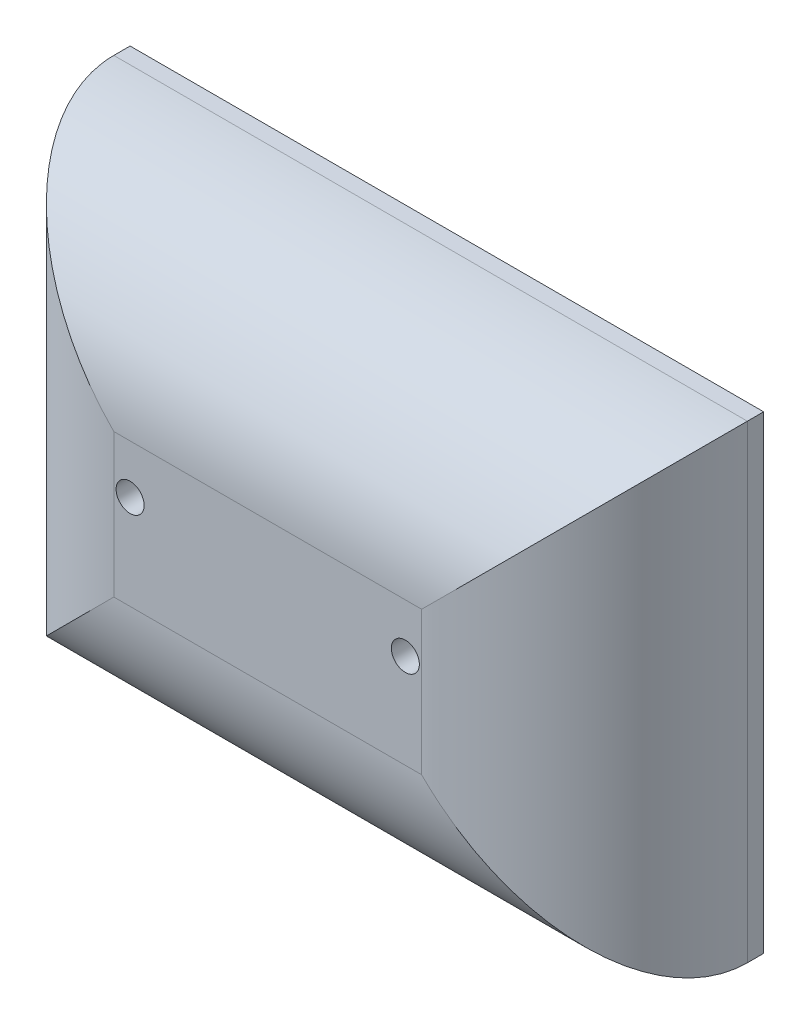
ISO-10303-21;
HEADER;
FILE_DESCRIPTION(('STEP AP214'),'2;1');
FILE_NAME('part.step','',(''),(''),'','','');
FILE_SCHEMA(('AUTOMOTIVE_DESIGN { 1 0 10303 214 1 1 1 1 }'));
ENDSEC;
DATA;
#1=APPLICATION_CONTEXT('core data for automotive mechanical design processes');
#2=APPLICATION_PROTOCOL_DEFINITION('international standard','automotive_design',2000,#1);
#3=PRODUCT_CONTEXT('',#1,'mechanical');
#4=PRODUCT('Part','Part','',(#3));
#5=PRODUCT_RELATED_PRODUCT_CATEGORY('part','',(#4));
#6=PRODUCT_DEFINITION_FORMATION('','',#4);
#7=PRODUCT_DEFINITION_CONTEXT('part definition',#1,'design');
#8=PRODUCT_DEFINITION('design','',#6,#7);
#9=PRODUCT_DEFINITION_SHAPE('','',#8);
#10=(LENGTH_UNIT() NAMED_UNIT(*) SI_UNIT(.MILLI.,.METRE.));
#11=(NAMED_UNIT(*) PLANE_ANGLE_UNIT() SI_UNIT($,.RADIAN.));
#12=(NAMED_UNIT(*) SI_UNIT($,.STERADIAN.) SOLID_ANGLE_UNIT());
#13=UNCERTAINTY_MEASURE_WITH_UNIT(LENGTH_MEASURE(1.E-05),#10,'distance_accuracy_value','');
#14=(GEOMETRIC_REPRESENTATION_CONTEXT(3) GLOBAL_UNCERTAINTY_ASSIGNED_CONTEXT((#13)) GLOBAL_UNIT_ASSIGNED_CONTEXT((#10,
#11,#12)) REPRESENTATION_CONTEXT('',''));
#15=CARTESIAN_POINT('',(0.,0.,0.));
#16=DIRECTION('',(0.,0.,1.));
#17=DIRECTION('',(1.,0.,0.));
#18=AXIS2_PLACEMENT_3D('',#15,#16,#17);
#19=CARTESIAN_POINT('',(0.,0.,55.));
#20=DIRECTION('',(0.,0.,1.));
#21=DIRECTION('',(1.,0.,0.));
#22=AXIS2_PLACEMENT_3D('',#19,#20,#21);
#23=PLANE('',#22);
#24=CARTESIAN_POINT('',(42.25,7.00000000000001,55.));
#25=DIRECTION('',(0.,0.,1.));
#26=DIRECTION('',(1.,0.,0.));
#27=AXIS2_PLACEMENT_3D('',#24,#25,#26);
#28=CIRCLE('',#27,4.29999999999999);
#29=CARTESIAN_POINT('',(46.55,7.00000000000001,55.));
#30=VERTEX_POINT('',#29);
#31=EDGE_CURVE('E163',#30,#30,#28,.T.);
#32=ORIENTED_EDGE('',*,*,#31,.F.);
#33=EDGE_LOOP('',(#32));
#34=FACE_BOUND('',#33,.T.);
#35=CARTESIAN_POINT('',(-42.25,7.00000000000001,55.));
#36=DIRECTION('',(0.,0.,1.));
#37=DIRECTION('',(1.,0.,0.));
#38=AXIS2_PLACEMENT_3D('',#35,#36,#37);
#39=CIRCLE('',#38,4.29999999999999);
#40=CARTESIAN_POINT('',(-37.95,7.00000000000001,55.));
#41=VERTEX_POINT('',#40);
#42=EDGE_CURVE('E151',#41,#41,#39,.T.);
#43=ORIENTED_EDGE('',*,*,#42,.F.);
#44=EDGE_LOOP('',(#43));
#45=FACE_BOUND('',#44,.T.);
#46=DIRECTION('',(0.,-1.,0.));
#47=VECTOR('',#46,1.);
#48=CARTESIAN_POINT('',(-47.25,72.,55.));
#49=LINE('',#48,#47);
#50=CARTESIAN_POINT('',(-47.25,22.,55.));
#51=VERTEX_POINT('',#50);
#52=CARTESIAN_POINT('',(-47.25,-22.,55.));
#53=VERTEX_POINT('',#52);
#54=EDGE_CURVE('E109',#51,#53,#49,.T.);
#55=ORIENTED_EDGE('',*,*,#54,.T.);
#56=DIRECTION('',(1.,0.,0.));
#57=VECTOR('',#56,1.);
#58=CARTESIAN_POINT('',(-97.25,-22.,55.));
#59=LINE('',#58,#57);
#60=CARTESIAN_POINT('',(47.25,-22.,55.));
#61=VERTEX_POINT('',#60);
#62=EDGE_CURVE('E86',#53,#61,#59,.T.);
#63=ORIENTED_EDGE('',*,*,#62,.T.);
#64=DIRECTION('',(0.,-1.,0.));
#65=VECTOR('',#64,1.);
#66=CARTESIAN_POINT('',(47.25,72.,55.));
#67=LINE('',#66,#65);
#68=CARTESIAN_POINT('',(47.25,22.,55.));
#69=VERTEX_POINT('',#68);
#70=EDGE_CURVE('E132',#69,#61,#67,.T.);
#71=ORIENTED_EDGE('',*,*,#70,.F.);
#72=DIRECTION('',(1.,0.,0.));
#73=VECTOR('',#72,1.);
#74=CARTESIAN_POINT('',(-97.25,22.,55.));
#75=LINE('',#74,#73);
#76=EDGE_CURVE('E48',#51,#69,#75,.T.);
#77=ORIENTED_EDGE('',*,*,#76,.F.);
#78=EDGE_LOOP('',(#55,#63,#71,#77));
#79=FACE_BOUND('',#78,.T.);
#80=ADVANCED_FACE('F33',(#34,#45,#79),#23,.T.);
#81=CARTESIAN_POINT('',(97.25,-72.,55.));
#82=DIRECTION('',(0.,1.,0.));
#83=DIRECTION('',(-1.,0.,0.));
#84=AXIS2_PLACEMENT_3D('',#81,#82,#83);
#85=PLANE('',#84);
#86=DIRECTION('',(1.,0.,0.));
#87=VECTOR('',#86,1.);
#88=CARTESIAN_POINT('',(-97.25,-72.,5.));
#89=LINE('',#88,#87);
#90=CARTESIAN_POINT('',(-97.25,-72.,5.));
#91=VERTEX_POINT('',#90);
#92=CARTESIAN_POINT('',(97.25,-72.,5.));
#93=VERTEX_POINT('',#92);
#94=EDGE_CURVE('E55',#91,#93,#89,.T.);
#95=ORIENTED_EDGE('',*,*,#94,.F.);
#96=DIRECTION('',(0.,0.,-1.));
#97=VECTOR('',#96,1.);
#98=CARTESIAN_POINT('',(-97.25,-72.,55.));
#99=LINE('',#98,#97);
#100=CARTESIAN_POINT('',(-97.25,-72.,0.));
#101=VERTEX_POINT('',#100);
#102=EDGE_CURVE('E98',#91,#101,#99,.T.);
#103=ORIENTED_EDGE('',*,*,#102,.T.);
#104=DIRECTION('',(1.,0.,0.));
#105=VECTOR('',#104,1.);
#106=CARTESIAN_POINT('',(97.25,-72.,0.));
#107=LINE('',#106,#105);
#108=CARTESIAN_POINT('',(97.25,-72.,0.));
#109=VERTEX_POINT('',#108);
#110=EDGE_CURVE('E128',#101,#109,#107,.T.);
#111=ORIENTED_EDGE('',*,*,#110,.T.);
#112=DIRECTION('',(0.,0.,-1.));
#113=VECTOR('',#112,1.);
#114=CARTESIAN_POINT('',(97.25,-72.,55.));
#115=LINE('',#114,#113);
#116=EDGE_CURVE('E100',#93,#109,#115,.T.);
#117=ORIENTED_EDGE('',*,*,#116,.F.);
#118=EDGE_LOOP('',(#95,#103,#111,#117));
#119=FACE_BOUND('',#118,.T.);
#120=ADVANCED_FACE('F95',(#119),#85,.F.);
#121=CARTESIAN_POINT('',(-47.25,72.,5.));
#122=DIRECTION('',(0.,-1.,0.));
#123=DIRECTION('',(1.,0.,0.));
#124=AXIS2_PLACEMENT_3D('',#121,#122,#123);
#125=CYLINDRICAL_SURFACE('',#124,50.);
#126=DIRECTION('',(0.,-1.,0.));
#127=VECTOR('',#126,1.);
#128=CARTESIAN_POINT('',(-97.25,72.,4.99999999999999));
#129=LINE('',#128,#127);
#130=CARTESIAN_POINT('',(-97.25,72.,5.));
#131=VERTEX_POINT('',#130);
#132=EDGE_CURVE('E104',#131,#91,#129,.T.);
#133=ORIENTED_EDGE('',*,*,#132,.T.);
#134=CARTESIAN_POINT('',(-47.25,-22.,4.99999999999999));
#135=DIRECTION('',(0.707106781186548,-0.707106781186547,0.));
#136=DIRECTION('',(-0.707106781186547,-0.707106781186548,0.));
#137=AXIS2_PLACEMENT_3D('',#134,#135,#136);
#138=ELLIPSE('',#137,70.7106781186548,50.);
#139=EDGE_CURVE('E83',#91,#53,#138,.F.);
#140=ORIENTED_EDGE('',*,*,#139,.T.);
#141=ORIENTED_EDGE('',*,*,#54,.F.);
#142=CARTESIAN_POINT('',(-47.25,22.,4.99999999999999));
#143=DIRECTION('',(-0.707106781186547,-0.707106781186548,0.));
#144=DIRECTION('',(0.707106781186548,-0.707106781186547,0.));
#145=AXIS2_PLACEMENT_3D('',#142,#143,#144);
#146=ELLIPSE('',#145,70.7106781186548,50.);
#147=EDGE_CURVE('E106',#131,#51,#146,.F.);
#148=ORIENTED_EDGE('',*,*,#147,.F.);
#149=EDGE_LOOP('',(#133,#140,#141,#148));
#150=FACE_BOUND('',#149,.T.);
#151=ADVANCED_FACE('F105',(#150),#125,.T.);
#152=CARTESIAN_POINT('',(47.25,72.,5.));
#153=DIRECTION('',(0.,-1.,0.));
#154=DIRECTION('',(1.,0.,0.));
#155=AXIS2_PLACEMENT_3D('',#152,#153,#154);
#156=CYLINDRICAL_SURFACE('',#155,50.);
#157=CARTESIAN_POINT('',(47.25,-22.,4.99999999999999));
#158=DIRECTION('',(-0.707106781186547,-0.707106781186547,0.));
#159=DIRECTION('',(0.707106781186547,-0.707106781186547,0.));
#160=AXIS2_PLACEMENT_3D('',#157,#158,#159);
#161=ELLIPSE('',#160,70.7106781186547,50.);
#162=EDGE_CURVE('E11',#93,#61,#161,.T.);
#163=ORIENTED_EDGE('',*,*,#162,.F.);
#164=DIRECTION('',(0.,-1.,0.));
#165=VECTOR('',#164,1.);
#166=CARTESIAN_POINT('',(97.25,72.,4.99999999999999));
#167=LINE('',#166,#165);
#168=CARTESIAN_POINT('',(97.25,72.,5.));
#169=VERTEX_POINT('',#168);
#170=EDGE_CURVE('E110',#169,#93,#167,.T.);
#171=ORIENTED_EDGE('',*,*,#170,.F.);
#172=CARTESIAN_POINT('',(47.25,22.,4.99999999999999));
#173=DIRECTION('',(0.707106781186547,-0.707106781186548,0.));
#174=DIRECTION('',(-0.707106781186548,-0.707106781186547,0.));
#175=AXIS2_PLACEMENT_3D('',#172,#173,#174);
#176=ELLIPSE('',#175,70.7106781186548,50.);
#177=EDGE_CURVE('E41',#169,#69,#176,.T.);
#178=ORIENTED_EDGE('',*,*,#177,.T.);
#179=ORIENTED_EDGE('',*,*,#70,.T.);
#180=EDGE_LOOP('',(#163,#171,#178,#179));
#181=FACE_BOUND('',#180,.T.);
#182=ADVANCED_FACE('F176',(#181),#156,.T.);
#183=CARTESIAN_POINT('',(97.25,72.,55.));
#184=DIRECTION('',(0.,-1.,0.));
#185=DIRECTION('',(1.,0.,0.));
#186=AXIS2_PLACEMENT_3D('',#183,#184,#185);
#187=PLANE('',#186);
#188=DIRECTION('',(1.,0.,0.));
#189=VECTOR('',#188,1.);
#190=CARTESIAN_POINT('',(-97.25,72.,5.));
#191=LINE('',#190,#189);
#192=EDGE_CURVE('E91',#131,#169,#191,.T.);
#193=ORIENTED_EDGE('',*,*,#192,.T.);
#194=DIRECTION('',(0.,0.,-1.));
#195=VECTOR('',#194,1.);
#196=CARTESIAN_POINT('',(97.25,72.,55.));
#197=LINE('',#196,#195);
#198=CARTESIAN_POINT('',(97.25,72.,0.));
#199=VERTEX_POINT('',#198);
#200=EDGE_CURVE('E116',#169,#199,#197,.T.);
#201=ORIENTED_EDGE('',*,*,#200,.T.);
#202=DIRECTION('',(-1.,0.,0.));
#203=VECTOR('',#202,1.);
#204=CARTESIAN_POINT('',(97.25,72.,0.));
#205=LINE('',#204,#203);
#206=CARTESIAN_POINT('',(-97.25,72.,0.));
#207=VERTEX_POINT('',#206);
#208=EDGE_CURVE('E122',#199,#207,#205,.T.);
#209=ORIENTED_EDGE('',*,*,#208,.T.);
#210=DIRECTION('',(0.,0.,-1.));
#211=VECTOR('',#210,1.);
#212=CARTESIAN_POINT('',(-97.25,72.,55.));
#213=LINE('',#212,#211);
#214=EDGE_CURVE('E120',#131,#207,#213,.T.);
#215=ORIENTED_EDGE('',*,*,#214,.F.);
#216=EDGE_LOOP('',(#193,#201,#209,#215));
#217=FACE_BOUND('',#216,.T.);
#218=ADVANCED_FACE('F181',(#217),#187,.F.);
#219=CARTESIAN_POINT('',(97.25,-72.,55.));
#220=DIRECTION('',(-1.,0.,0.));
#221=DIRECTION('',(0.,0.,1.));
#222=AXIS2_PLACEMENT_3D('',#219,#220,#221);
#223=PLANE('',#222);
#224=ORIENTED_EDGE('',*,*,#170,.T.);
#225=ORIENTED_EDGE('',*,*,#116,.T.);
#226=DIRECTION('',(0.,1.,0.));
#227=VECTOR('',#226,1.);
#228=CARTESIAN_POINT('',(97.25,-72.,0.));
#229=LINE('',#228,#227);
#230=EDGE_CURVE('E125',#109,#199,#229,.T.);
#231=ORIENTED_EDGE('',*,*,#230,.T.);
#232=ORIENTED_EDGE('',*,*,#200,.F.);
#233=EDGE_LOOP('',(#224,#225,#231,#232));
#234=FACE_BOUND('',#233,.T.);
#235=ADVANCED_FACE('F187',(#234),#223,.F.);
#236=CARTESIAN_POINT('',(-97.25,-72.,55.));
#237=DIRECTION('',(1.,0.,0.));
#238=DIRECTION('',(0.,0.,-1.));
#239=AXIS2_PLACEMENT_3D('',#236,#237,#238);
#240=PLANE('',#239);
#241=ORIENTED_EDGE('',*,*,#132,.F.);
#242=ORIENTED_EDGE('',*,*,#214,.T.);
#243=DIRECTION('',(0.,-1.,0.));
#244=VECTOR('',#243,1.);
#245=CARTESIAN_POINT('',(-97.25,-72.,0.));
#246=LINE('',#245,#244);
#247=EDGE_CURVE('E114',#207,#101,#246,.T.);
#248=ORIENTED_EDGE('',*,*,#247,.T.);
#249=ORIENTED_EDGE('',*,*,#102,.F.);
#250=EDGE_LOOP('',(#241,#242,#248,#249));
#251=FACE_BOUND('',#250,.T.);
#252=ADVANCED_FACE('F35',(#251),#240,.F.);
#253=CARTESIAN_POINT('',(0.,0.,0.));
#254=DIRECTION('',(0.,0.,1.));
#255=DIRECTION('',(1.,0.,0.));
#256=AXIS2_PLACEMENT_3D('',#253,#254,#255);
#257=PLANE('',#256);
#258=CARTESIAN_POINT('',(42.25,7.00000000000001,0.));
#259=DIRECTION('',(0.,0.,1.));
#260=DIRECTION('',(1.,0.,0.));
#261=AXIS2_PLACEMENT_3D('',#258,#259,#260);
#262=CIRCLE('',#261,2.24999999999999);
#263=CARTESIAN_POINT('',(44.5,7.00000000000001,0.));
#264=VERTEX_POINT('',#263);
#265=EDGE_CURVE('E154',#264,#264,#262,.T.);
#266=ORIENTED_EDGE('',*,*,#265,.T.);
#267=EDGE_LOOP('',(#266));
#268=FACE_BOUND('',#267,.T.);
#269=CARTESIAN_POINT('',(-42.25,7.00000000000001,0.));
#270=DIRECTION('',(0.,0.,1.));
#271=DIRECTION('',(1.,0.,0.));
#272=AXIS2_PLACEMENT_3D('',#269,#270,#271);
#273=CIRCLE('',#272,2.24999999999999);
#274=CARTESIAN_POINT('',(-40.,7.00000000000001,0.));
#275=VERTEX_POINT('',#274);
#276=EDGE_CURVE('E141',#275,#275,#273,.T.);
#277=ORIENTED_EDGE('',*,*,#276,.T.);
#278=EDGE_LOOP('',(#277));
#279=FACE_BOUND('',#278,.T.);
#280=ORIENTED_EDGE('',*,*,#247,.F.);
#281=ORIENTED_EDGE('',*,*,#208,.F.);
#282=ORIENTED_EDGE('',*,*,#230,.F.);
#283=ORIENTED_EDGE('',*,*,#110,.F.);
#284=EDGE_LOOP('',(#280,#281,#282,#283));
#285=FACE_BOUND('',#284,.T.);
#286=ADVANCED_FACE('F185',(#268,#279,#285),#257,.F.);
#287=CARTESIAN_POINT('',(-97.25,22.,4.99999999999999));
#288=DIRECTION('',(1.,0.,0.));
#289=DIRECTION('',(0.,0.,-1.));
#290=AXIS2_PLACEMENT_3D('',#287,#288,#289);
#291=CYLINDRICAL_SURFACE('',#290,50.);
#292=ORIENTED_EDGE('',*,*,#147,.T.);
#293=ORIENTED_EDGE('',*,*,#76,.T.);
#294=ORIENTED_EDGE('',*,*,#177,.F.);
#295=ORIENTED_EDGE('',*,*,#192,.F.);
#296=EDGE_LOOP('',(#292,#293,#294,#295));
#297=FACE_BOUND('',#296,.T.);
#298=ADVANCED_FACE('F179',(#297),#291,.T.);
#299=CARTESIAN_POINT('',(-97.25,-22.,4.99999999999999));
#300=DIRECTION('',(1.,0.,0.));
#301=DIRECTION('',(0.,1.,0.));
#302=AXIS2_PLACEMENT_3D('',#299,#300,#301);
#303=CYLINDRICAL_SURFACE('',#302,50.);
#304=ORIENTED_EDGE('',*,*,#94,.T.);
#305=ORIENTED_EDGE('',*,*,#162,.T.);
#306=ORIENTED_EDGE('',*,*,#62,.F.);
#307=ORIENTED_EDGE('',*,*,#139,.F.);
#308=EDGE_LOOP('',(#304,#305,#306,#307));
#309=FACE_BOUND('',#308,.T.);
#310=ADVANCED_FACE('F84',(#309),#303,.T.);
#311=CARTESIAN_POINT('',(-42.25,7.00000000000001,55.));
#312=DIRECTION('',(0.,0.,1.));
#313=DIRECTION('',(1.,0.,0.));
#314=AXIS2_PLACEMENT_3D('',#311,#312,#313);
#315=CYLINDRICAL_SURFACE('',#314,2.24999999999999);
#316=ORIENTED_EDGE('',*,*,#276,.F.);
#317=EDGE_LOOP('',(#316));
#318=FACE_BOUND('',#317,.T.);
#319=CARTESIAN_POINT('',(-42.25,7.00000000000001,5.));
#320=DIRECTION('',(0.,0.,1.));
#321=DIRECTION('',(1.,0.,0.));
#322=AXIS2_PLACEMENT_3D('',#319,#320,#321);
#323=CIRCLE('',#322,2.24999999999999);
#324=CARTESIAN_POINT('',(-40.,7.00000000000001,5.));
#325=VERTEX_POINT('',#324);
#326=EDGE_CURVE('E145',#325,#325,#323,.T.);
#327=ORIENTED_EDGE('',*,*,#326,.T.);
#328=EDGE_LOOP('',(#327));
#329=FACE_BOUND('',#328,.T.);
#330=ADVANCED_FACE('F217',(#318,#329),#315,.F.);
#331=CARTESIAN_POINT('',(-40.,7.00000000000001,5.));
#332=DIRECTION('',(0.,0.,-1.));
#333=DIRECTION('',(-1.,0.,0.));
#334=AXIS2_PLACEMENT_3D('',#331,#332,#333);
#335=PLANE('',#334);
#336=ORIENTED_EDGE('',*,*,#326,.F.);
#337=EDGE_LOOP('',(#336));
#338=FACE_BOUND('',#337,.T.);
#339=CARTESIAN_POINT('',(-42.25,7.00000000000001,5.));
#340=DIRECTION('',(0.,0.,1.));
#341=DIRECTION('',(1.,0.,0.));
#342=AXIS2_PLACEMENT_3D('',#339,#340,#341);
#343=CIRCLE('',#342,4.29999999999999);
#344=CARTESIAN_POINT('',(-37.95,7.00000000000001,5.));
#345=VERTEX_POINT('',#344);
#346=EDGE_CURVE('E148',#345,#345,#343,.T.);
#347=ORIENTED_EDGE('',*,*,#346,.T.);
#348=EDGE_LOOP('',(#347));
#349=FACE_BOUND('',#348,.T.);
#350=ADVANCED_FACE('F220',(#338,#349),#335,.F.);
#351=CARTESIAN_POINT('',(-42.25,7.00000000000001,55.));
#352=DIRECTION('',(0.,0.,1.));
#353=DIRECTION('',(1.,0.,0.));
#354=AXIS2_PLACEMENT_3D('',#351,#352,#353);
#355=CYLINDRICAL_SURFACE('',#354,4.29999999999999);
#356=ORIENTED_EDGE('',*,*,#346,.F.);
#357=EDGE_LOOP('',(#356));
#358=FACE_BOUND('',#357,.T.);
#359=ORIENTED_EDGE('',*,*,#42,.T.);
#360=EDGE_LOOP('',(#359));
#361=FACE_BOUND('',#360,.T.);
#362=ADVANCED_FACE('F226',(#358,#361),#355,.F.);
#363=CARTESIAN_POINT('',(42.25,7.00000000000001,55.));
#364=DIRECTION('',(0.,0.,1.));
#365=DIRECTION('',(1.,0.,0.));
#366=AXIS2_PLACEMENT_3D('',#363,#364,#365);
#367=CYLINDRICAL_SURFACE('',#366,2.24999999999999);
#368=ORIENTED_EDGE('',*,*,#265,.F.);
#369=EDGE_LOOP('',(#368));
#370=FACE_BOUND('',#369,.T.);
#371=CARTESIAN_POINT('',(42.25,7.00000000000001,5.));
#372=DIRECTION('',(0.,0.,1.));
#373=DIRECTION('',(1.,0.,0.));
#374=AXIS2_PLACEMENT_3D('',#371,#372,#373);
#375=CIRCLE('',#374,2.24999999999999);
#376=CARTESIAN_POINT('',(44.5,7.00000000000001,5.));
#377=VERTEX_POINT('',#376);
#378=EDGE_CURVE('E157',#377,#377,#375,.T.);
#379=ORIENTED_EDGE('',*,*,#378,.T.);
#380=EDGE_LOOP('',(#379));
#381=FACE_BOUND('',#380,.T.);
#382=ADVANCED_FACE('F232',(#370,#381),#367,.F.);
#383=CARTESIAN_POINT('',(44.5,7.00000000000001,5.));
#384=DIRECTION('',(0.,0.,-1.));
#385=DIRECTION('',(-1.,0.,0.));
#386=AXIS2_PLACEMENT_3D('',#383,#384,#385);
#387=PLANE('',#386);
#388=ORIENTED_EDGE('',*,*,#378,.F.);
#389=EDGE_LOOP('',(#388));
#390=FACE_BOUND('',#389,.T.);
#391=CARTESIAN_POINT('',(42.25,7.00000000000001,5.));
#392=DIRECTION('',(0.,0.,1.));
#393=DIRECTION('',(1.,0.,0.));
#394=AXIS2_PLACEMENT_3D('',#391,#392,#393);
#395=CIRCLE('',#394,4.29999999999999);
#396=CARTESIAN_POINT('',(46.55,7.00000000000001,5.));
#397=VERTEX_POINT('',#396);
#398=EDGE_CURVE('E160',#397,#397,#395,.T.);
#399=ORIENTED_EDGE('',*,*,#398,.T.);
#400=EDGE_LOOP('',(#399));
#401=FACE_BOUND('',#400,.T.);
#402=ADVANCED_FACE('F237',(#390,#401),#387,.F.);
#403=CARTESIAN_POINT('',(42.25,7.00000000000001,55.));
#404=DIRECTION('',(0.,0.,1.));
#405=DIRECTION('',(1.,0.,0.));
#406=AXIS2_PLACEMENT_3D('',#403,#404,#405);
#407=CYLINDRICAL_SURFACE('',#406,4.29999999999999);
#408=ORIENTED_EDGE('',*,*,#398,.F.);
#409=EDGE_LOOP('',(#408));
#410=FACE_BOUND('',#409,.T.);
#411=ORIENTED_EDGE('',*,*,#31,.T.);
#412=EDGE_LOOP('',(#411));
#413=FACE_BOUND('',#412,.T.);
#414=ADVANCED_FACE('F167',(#410,#413),#407,.F.);
#415=CLOSED_SHELL('',(#80,#120,#151,#182,#218,#235,#252,#286,#298,#310,#330,#350,#362,#382,#402,#414));
#416=MANIFOLD_SOLID_BREP('B2',#415);
#417=ADVANCED_BREP_SHAPE_REPRESENTATION('',(#18,#416),#14);
#418=SHAPE_DEFINITION_REPRESENTATION(#9,#417);
ENDSEC;
END-ISO-10303-21;
